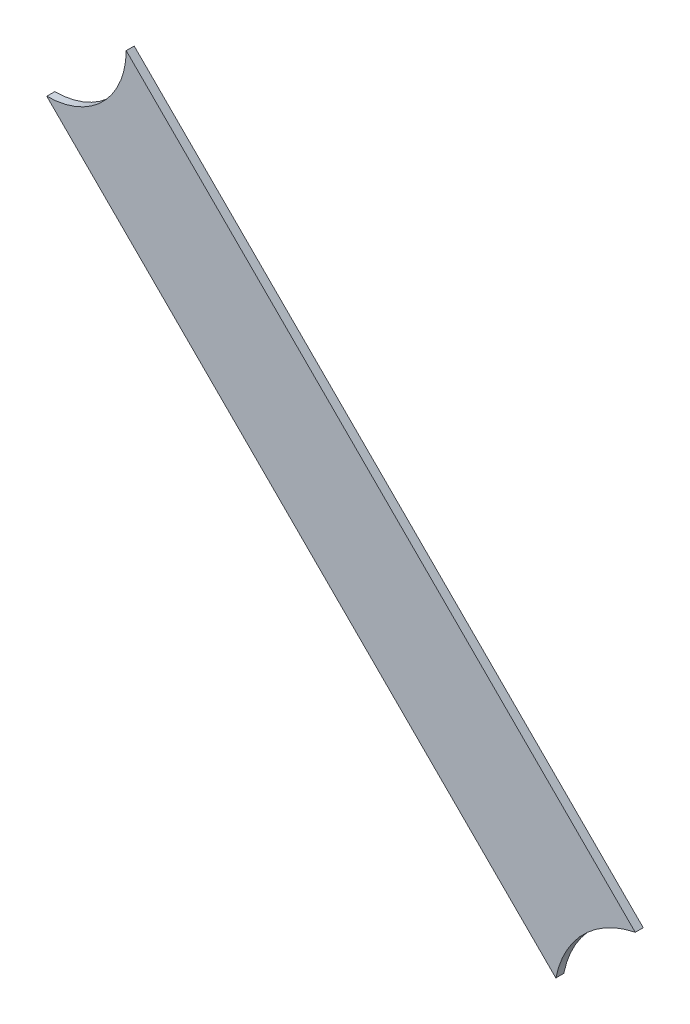
ISO-10303-21;
HEADER;
FILE_DESCRIPTION(('STEP AP214'),'2;1');
FILE_NAME('part.step','',(''),(''),'','','');
FILE_SCHEMA(('AUTOMOTIVE_DESIGN { 1 0 10303 214 1 1 1 1 }'));
ENDSEC;
DATA;
#1=APPLICATION_CONTEXT('core data for automotive mechanical design processes');
#2=APPLICATION_PROTOCOL_DEFINITION('international standard','automotive_design',2000,#1);
#3=PRODUCT_CONTEXT('',#1,'mechanical');
#4=PRODUCT('Part','Part','',(#3));
#5=PRODUCT_RELATED_PRODUCT_CATEGORY('part','',(#4));
#6=PRODUCT_DEFINITION_FORMATION('','',#4);
#7=PRODUCT_DEFINITION_CONTEXT('part definition',#1,'design');
#8=PRODUCT_DEFINITION('design','',#6,#7);
#9=PRODUCT_DEFINITION_SHAPE('','',#8);
#10=(LENGTH_UNIT() NAMED_UNIT(*) SI_UNIT(.MILLI.,.METRE.));
#11=(NAMED_UNIT(*) PLANE_ANGLE_UNIT() SI_UNIT($,.RADIAN.));
#12=(NAMED_UNIT(*) SI_UNIT($,.STERADIAN.) SOLID_ANGLE_UNIT());
#13=UNCERTAINTY_MEASURE_WITH_UNIT(LENGTH_MEASURE(1.E-05),#10,'distance_accuracy_value','');
#14=(GEOMETRIC_REPRESENTATION_CONTEXT(3) GLOBAL_UNCERTAINTY_ASSIGNED_CONTEXT((#13)) GLOBAL_UNIT_ASSIGNED_CONTEXT((#10,
#11,#12)) REPRESENTATION_CONTEXT('',''));
#15=CARTESIAN_POINT('',(0.,0.,0.));
#16=DIRECTION('',(0.,0.,1.));
#17=DIRECTION('',(1.,0.,0.));
#18=AXIS2_PLACEMENT_3D('',#15,#16,#17);
#19=CARTESIAN_POINT('',(45.4015517371068,104.144402662893,0.));
#20=DIRECTION('',(0.707106781186548,0.707106781186548,0.));
#21=DIRECTION('',(0.707106781186548,-0.707106781186548,0.));
#22=AXIS2_PLACEMENT_3D('',#19,#20,#21);
#23=PLANE('',#22);
#24=DIRECTION('',(0.707106781186548,-0.707106781186548,0.));
#25=VECTOR('',#24,1.);
#26=CARTESIAN_POINT('',(45.22322426,104.32273014,0.03556));
#27=LINE('',#26,#25);
#28=CARTESIAN_POINT('',(45.4015517371068,104.144402662893,0.03556));
#29=VERTEX_POINT('',#28);
#30=CARTESIAN_POINT('',(47.6697345698204,101.87621983018,0.03556));
#31=VERTEX_POINT('',#30);
#32=EDGE_CURVE('E11',#29,#31,#27,.T.);
#33=ORIENTED_EDGE('',*,*,#32,.F.);
#34=DIRECTION('',(0.,0.,1.));
#35=VECTOR('',#34,1.);
#36=CARTESIAN_POINT('',(45.4015517371068,104.144402662893,0.));
#37=LINE('',#36,#35);
#38=CARTESIAN_POINT('',(45.4015517371068,104.144402662893,0.));
#39=VERTEX_POINT('',#38);
#40=EDGE_CURVE('E24',#39,#29,#37,.T.);
#41=ORIENTED_EDGE('',*,*,#40,.F.);
#42=DIRECTION('',(0.707106781186548,-0.707106781186548,0.));
#43=VECTOR('',#42,1.);
#44=CARTESIAN_POINT('',(45.22322426,104.32273014,0.));
#45=LINE('',#44,#43);
#46=CARTESIAN_POINT('',(47.6697345698204,101.87621983018,0.));
#47=VERTEX_POINT('',#46);
#48=EDGE_CURVE('E75',#39,#47,#45,.T.);
#49=ORIENTED_EDGE('',*,*,#48,.T.);
#50=DIRECTION('',(0.,0.,1.));
#51=VECTOR('',#50,1.);
#52=CARTESIAN_POINT('',(47.6697345698204,101.87621983018,0.));
#53=LINE('',#52,#51);
#54=EDGE_CURVE('E37',#47,#31,#53,.T.);
#55=ORIENTED_EDGE('',*,*,#54,.T.);
#56=EDGE_LOOP('',(#33,#41,#49,#55));
#57=FACE_BOUND('',#56,.T.);
#58=ADVANCED_FACE('F17',(#57),#23,.F.);
#59=CARTESIAN_POINT('',(48.1110036,101.7880108,0.));
#60=DIRECTION('',(0.,0.,-1.));
#61=DIRECTION('',(1.,0.,0.));
#62=AXIS2_PLACEMENT_3D('',#59,#60,#61);
#63=CYLINDRICAL_SURFACE('',#62,0.4499991);
#64=DIRECTION('',(0.,0.,1.));
#65=VECTOR('',#64,1.);
#66=CARTESIAN_POINT('',(48.0236165692539,102.229443350746,0.));
#67=LINE('',#66,#65);
#68=CARTESIAN_POINT('',(48.0236165692539,102.229443350746,0.));
#69=VERTEX_POINT('',#68);
#70=CARTESIAN_POINT('',(48.0236165692539,102.229443350746,0.03556));
#71=VERTEX_POINT('',#70);
#72=EDGE_CURVE('E67',#69,#71,#67,.T.);
#73=ORIENTED_EDGE('',*,*,#72,.T.);
#74=CARTESIAN_POINT('',(48.1110036,101.7880108,0.03556));
#75=DIRECTION('',(0.,0.,1.));
#76=DIRECTION('',(1.,0.,0.));
#77=AXIS2_PLACEMENT_3D('',#74,#75,#76);
#78=CIRCLE('',#77,0.4499991);
#79=EDGE_CURVE('E82',#71,#31,#78,.T.);
#80=ORIENTED_EDGE('',*,*,#79,.T.);
#81=ORIENTED_EDGE('',*,*,#54,.F.);
#82=CARTESIAN_POINT('',(48.1110036,101.7880108,0.));
#83=DIRECTION('',(0.,0.,1.));
#84=DIRECTION('',(1.,0.,0.));
#85=AXIS2_PLACEMENT_3D('',#82,#83,#84);
#86=CIRCLE('',#85,0.4499991);
#87=EDGE_CURVE('E80',#69,#47,#86,.T.);
#88=ORIENTED_EDGE('',*,*,#87,.F.);
#89=EDGE_LOOP('',(#73,#80,#81,#88));
#90=FACE_BOUND('',#89,.T.);
#91=ADVANCED_FACE('F88',(#90),#63,.F.);
#92=CARTESIAN_POINT('',(48.0236165692539,102.229443350746,0.));
#93=DIRECTION('',(-0.707106781186548,-0.707106781186548,0.));
#94=DIRECTION('',(-0.707106781186548,0.707106781186548,0.));
#95=AXIS2_PLACEMENT_3D('',#92,#93,#94);
#96=PLANE('',#95);
#97=DIRECTION('',(-0.707106781186548,0.707106781186548,0.));
#98=VECTOR('',#97,1.);
#99=CARTESIAN_POINT('',(48.28777998,101.96527994,0.03556));
#100=LINE('',#99,#98);
#101=CARTESIAN_POINT('',(45.7555916326813,104.497468287319,0.03556));
#102=VERTEX_POINT('',#101);
#103=EDGE_CURVE('E71',#71,#102,#100,.T.);
#104=ORIENTED_EDGE('',*,*,#103,.F.);
#105=ORIENTED_EDGE('',*,*,#72,.F.);
#106=DIRECTION('',(-0.707106781186548,0.707106781186548,0.));
#107=VECTOR('',#106,1.);
#108=CARTESIAN_POINT('',(48.28777998,101.96527994,0.));
#109=LINE('',#108,#107);
#110=CARTESIAN_POINT('',(45.7555916326813,104.497468287319,0.));
#111=VERTEX_POINT('',#110);
#112=EDGE_CURVE('E63',#69,#111,#109,.T.);
#113=ORIENTED_EDGE('',*,*,#112,.T.);
#114=DIRECTION('',(0.,0.,1.));
#115=VECTOR('',#114,1.);
#116=CARTESIAN_POINT('',(45.7555916326813,104.497468287319,0.));
#117=LINE('',#116,#115);
#118=EDGE_CURVE('E53',#111,#102,#117,.T.);
#119=ORIENTED_EDGE('',*,*,#118,.T.);
#120=EDGE_LOOP('',(#104,#105,#113,#119));
#121=FACE_BOUND('',#120,.T.);
#122=ADVANCED_FACE('F66',(#121),#96,.F.);
#123=CARTESIAN_POINT('',(45.40000064,104.49999928,0.));
#124=DIRECTION('',(0.,0.,-1.));
#125=DIRECTION('',(1.,0.,0.));
#126=AXIS2_PLACEMENT_3D('',#123,#124,#125);
#127=CYLINDRICAL_SURFACE('',#126,0.3556);
#128=ORIENTED_EDGE('',*,*,#40,.T.);
#129=CARTESIAN_POINT('',(45.40000064,104.49999928,0.03556));
#130=DIRECTION('',(0.,0.,1.));
#131=DIRECTION('',(1.,0.,0.));
#132=AXIS2_PLACEMENT_3D('',#129,#130,#131);
#133=CIRCLE('',#132,0.3556);
#134=EDGE_CURVE('E59',#29,#102,#133,.T.);
#135=ORIENTED_EDGE('',*,*,#134,.T.);
#136=ORIENTED_EDGE('',*,*,#118,.F.);
#137=CARTESIAN_POINT('',(45.40000064,104.49999928,0.));
#138=DIRECTION('',(0.,0.,1.));
#139=DIRECTION('',(1.,0.,0.));
#140=AXIS2_PLACEMENT_3D('',#137,#138,#139);
#141=CIRCLE('',#140,0.3556);
#142=EDGE_CURVE('E57',#39,#111,#141,.T.);
#143=ORIENTED_EDGE('',*,*,#142,.F.);
#144=EDGE_LOOP('',(#128,#135,#136,#143));
#145=FACE_BOUND('',#144,.T.);
#146=ADVANCED_FACE('F55',(#145),#127,.F.);
#147=CARTESIAN_POINT('',(45.22322426,104.32273014,0.));
#148=DIRECTION('',(0.,0.,-1.));
#149=DIRECTION('',(-1.,0.,0.));
#150=AXIS2_PLACEMENT_3D('',#147,#148,#149);
#151=PLANE('',#150);
#152=ORIENTED_EDGE('',*,*,#48,.F.);
#153=ORIENTED_EDGE('',*,*,#142,.T.);
#154=ORIENTED_EDGE('',*,*,#112,.F.);
#155=ORIENTED_EDGE('',*,*,#87,.T.);
#156=EDGE_LOOP('',(#152,#153,#154,#155));
#157=FACE_BOUND('',#156,.T.);
#158=ADVANCED_FACE('F74',(#157),#151,.T.);
#159=CARTESIAN_POINT('',(45.22322426,104.32273014,0.03556));
#160=DIRECTION('',(0.,0.,-1.));
#161=DIRECTION('',(-1.,0.,0.));
#162=AXIS2_PLACEMENT_3D('',#159,#160,#161);
#163=PLANE('',#162);
#164=ORIENTED_EDGE('',*,*,#134,.F.);
#165=ORIENTED_EDGE('',*,*,#32,.T.);
#166=ORIENTED_EDGE('',*,*,#79,.F.);
#167=ORIENTED_EDGE('',*,*,#103,.T.);
#168=EDGE_LOOP('',(#164,#165,#166,#167));
#169=FACE_BOUND('',#168,.T.);
#170=ADVANCED_FACE('F91',(#169),#163,.F.);
#171=CLOSED_SHELL('',(#58,#91,#122,#146,#158,#170));
#172=MANIFOLD_SOLID_BREP('B1',#171);
#173=ADVANCED_BREP_SHAPE_REPRESENTATION('',(#18,#172),#14);
#174=SHAPE_DEFINITION_REPRESENTATION(#9,#173);
ENDSEC;
END-ISO-10303-21;
